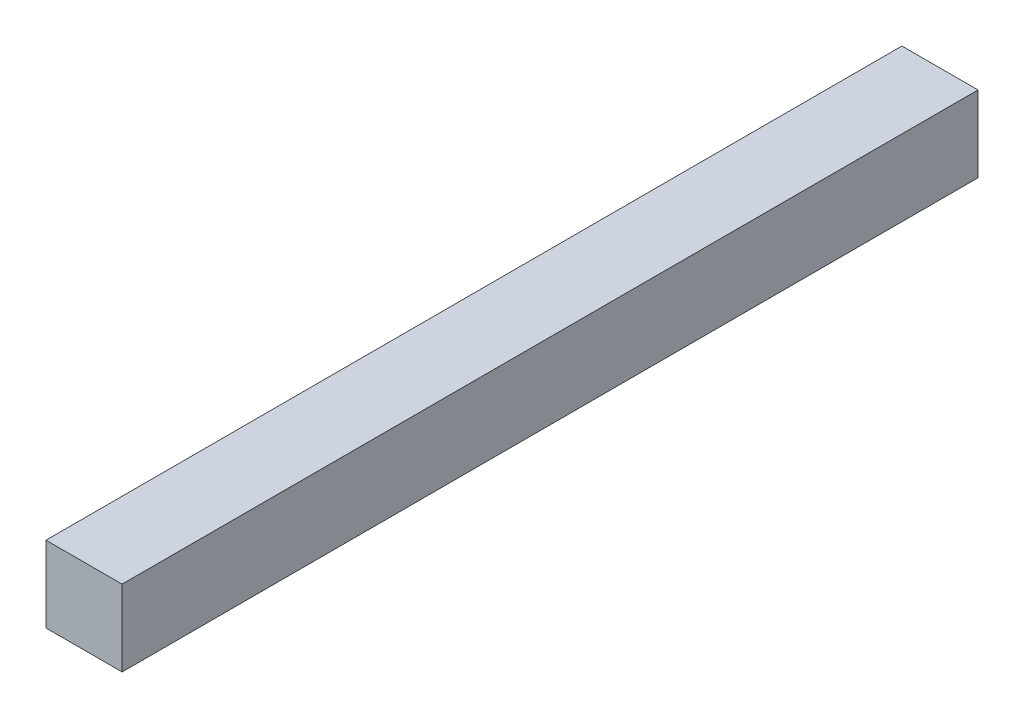
ISO-10303-21;
HEADER;
FILE_DESCRIPTION(('STEP AP214'),'2;1');
FILE_NAME('part.step','',(''),(''),'','','');
FILE_SCHEMA(('AUTOMOTIVE_DESIGN { 1 0 10303 214 1 1 1 1 }'));
ENDSEC;
DATA;
#1=APPLICATION_CONTEXT('core data for automotive mechanical design processes');
#2=APPLICATION_PROTOCOL_DEFINITION('international standard','automotive_design',2000,#1);
#3=PRODUCT_CONTEXT('',#1,'mechanical');
#4=PRODUCT('Part','Part','',(#3));
#5=PRODUCT_RELATED_PRODUCT_CATEGORY('part','',(#4));
#6=PRODUCT_DEFINITION_FORMATION('','',#4);
#7=PRODUCT_DEFINITION_CONTEXT('part definition',#1,'design');
#8=PRODUCT_DEFINITION('design','',#6,#7);
#9=PRODUCT_DEFINITION_SHAPE('','',#8);
#10=(LENGTH_UNIT() NAMED_UNIT(*) SI_UNIT(.MILLI.,.METRE.));
#11=(NAMED_UNIT(*) PLANE_ANGLE_UNIT() SI_UNIT($,.RADIAN.));
#12=(NAMED_UNIT(*) SI_UNIT($,.STERADIAN.) SOLID_ANGLE_UNIT());
#13=UNCERTAINTY_MEASURE_WITH_UNIT(LENGTH_MEASURE(1.E-05),#10,'distance_accuracy_value','');
#14=(GEOMETRIC_REPRESENTATION_CONTEXT(3) GLOBAL_UNCERTAINTY_ASSIGNED_CONTEXT((#13)) GLOBAL_UNIT_ASSIGNED_CONTEXT((#10,
#11,#12)) REPRESENTATION_CONTEXT('',''));
#15=CARTESIAN_POINT('',(0.,0.,0.));
#16=DIRECTION('',(0.,0.,1.));
#17=DIRECTION('',(1.,0.,0.));
#18=AXIS2_PLACEMENT_3D('',#15,#16,#17);
#19=CARTESIAN_POINT('',(0.,0.,1000.));
#20=DIRECTION('',(1.,0.,0.));
#21=DIRECTION('',(0.,0.,-1.));
#22=AXIS2_PLACEMENT_3D('',#19,#20,#21);
#23=PLANE('',#22);
#24=DIRECTION('',(0.,-1.,0.));
#25=VECTOR('',#24,1.);
#26=CARTESIAN_POINT('',(0.,0.,0.));
#27=LINE('',#26,#25);
#28=CARTESIAN_POINT('',(0.,88.9,0.));
#29=VERTEX_POINT('',#28);
#30=CARTESIAN_POINT('',(0.,0.,0.));
#31=VERTEX_POINT('',#30);
#32=EDGE_CURVE('E98',#29,#31,#27,.T.);
#33=ORIENTED_EDGE('',*,*,#32,.T.);
#34=DIRECTION('',(0.,0.,-1.));
#35=VECTOR('',#34,1.);
#36=CARTESIAN_POINT('',(0.,0.,1000.));
#37=LINE('',#36,#35);
#38=CARTESIAN_POINT('',(0.,0.,1000.));
#39=VERTEX_POINT('',#38);
#40=EDGE_CURVE('E11',#39,#31,#37,.T.);
#41=ORIENTED_EDGE('',*,*,#40,.F.);
#42=DIRECTION('',(0.,-1.,0.));
#43=VECTOR('',#42,1.);
#44=CARTESIAN_POINT('',(0.,0.,1000.));
#45=LINE('',#44,#43);
#46=CARTESIAN_POINT('',(0.,88.9,1000.));
#47=VERTEX_POINT('',#46);
#48=EDGE_CURVE('E86',#47,#39,#45,.T.);
#49=ORIENTED_EDGE('',*,*,#48,.F.);
#50=DIRECTION('',(0.,0.,-1.));
#51=VECTOR('',#50,1.);
#52=CARTESIAN_POINT('',(0.,88.9,1000.));
#53=LINE('',#52,#51);
#54=EDGE_CURVE('E94',#47,#29,#53,.T.);
#55=ORIENTED_EDGE('',*,*,#54,.T.);
#56=EDGE_LOOP('',(#33,#41,#49,#55));
#57=FACE_BOUND('',#56,.T.);
#58=ADVANCED_FACE('F35',(#57),#23,.F.);
#59=CARTESIAN_POINT('',(0.,0.,1000.));
#60=DIRECTION('',(0.,1.,0.));
#61=DIRECTION('',(0.,0.,1.));
#62=AXIS2_PLACEMENT_3D('',#59,#60,#61);
#63=PLANE('',#62);
#64=DIRECTION('',(1.,0.,0.));
#65=VECTOR('',#64,1.);
#66=CARTESIAN_POINT('',(0.,0.,0.));
#67=LINE('',#66,#65);
#68=CARTESIAN_POINT('',(88.9,0.,0.));
#69=VERTEX_POINT('',#68);
#70=EDGE_CURVE('E90',#31,#69,#67,.T.);
#71=ORIENTED_EDGE('',*,*,#70,.T.);
#72=DIRECTION('',(0.,0.,-1.));
#73=VECTOR('',#72,1.);
#74=CARTESIAN_POINT('',(88.9,0.,1000.));
#75=LINE('',#74,#73);
#76=CARTESIAN_POINT('',(88.9,0.,1000.));
#77=VERTEX_POINT('',#76);
#78=EDGE_CURVE('E43',#77,#69,#75,.T.);
#79=ORIENTED_EDGE('',*,*,#78,.F.);
#80=DIRECTION('',(1.,0.,0.));
#81=VECTOR('',#80,1.);
#82=CARTESIAN_POINT('',(0.,0.,1000.));
#83=LINE('',#82,#81);
#84=EDGE_CURVE('E81',#39,#77,#83,.T.);
#85=ORIENTED_EDGE('',*,*,#84,.F.);
#86=ORIENTED_EDGE('',*,*,#40,.T.);
#87=EDGE_LOOP('',(#71,#79,#85,#86));
#88=FACE_BOUND('',#87,.T.);
#89=ADVANCED_FACE('F89',(#88),#63,.F.);
#90=CARTESIAN_POINT('',(88.9,0.,1000.));
#91=DIRECTION('',(-1.,0.,0.));
#92=DIRECTION('',(0.,-1.,0.));
#93=AXIS2_PLACEMENT_3D('',#90,#91,#92);
#94=PLANE('',#93);
#95=DIRECTION('',(0.,1.,0.));
#96=VECTOR('',#95,1.);
#97=CARTESIAN_POINT('',(88.9,0.,0.));
#98=LINE('',#97,#96);
#99=CARTESIAN_POINT('',(88.9,88.9,0.));
#100=VERTEX_POINT('',#99);
#101=EDGE_CURVE('E68',#69,#100,#98,.T.);
#102=ORIENTED_EDGE('',*,*,#101,.T.);
#103=DIRECTION('',(0.,0.,-1.));
#104=VECTOR('',#103,1.);
#105=CARTESIAN_POINT('',(88.9,88.9,1000.));
#106=LINE('',#105,#104);
#107=CARTESIAN_POINT('',(88.9,88.9,1000.));
#108=VERTEX_POINT('',#107);
#109=EDGE_CURVE('E91',#108,#100,#106,.T.);
#110=ORIENTED_EDGE('',*,*,#109,.F.);
#111=DIRECTION('',(0.,1.,0.));
#112=VECTOR('',#111,1.);
#113=CARTESIAN_POINT('',(88.9,0.,1000.));
#114=LINE('',#113,#112);
#115=EDGE_CURVE('E84',#77,#108,#114,.T.);
#116=ORIENTED_EDGE('',*,*,#115,.F.);
#117=ORIENTED_EDGE('',*,*,#78,.T.);
#118=EDGE_LOOP('',(#102,#110,#116,#117));
#119=FACE_BOUND('',#118,.T.);
#120=ADVANCED_FACE('F92',(#119),#94,.F.);
#121=CARTESIAN_POINT('',(0.,88.9,1000.));
#122=DIRECTION('',(0.,-1.,0.));
#123=DIRECTION('',(1.,0.,0.));
#124=AXIS2_PLACEMENT_3D('',#121,#122,#123);
#125=PLANE('',#124);
#126=DIRECTION('',(-1.,0.,0.));
#127=VECTOR('',#126,1.);
#128=CARTESIAN_POINT('',(0.,88.9,0.));
#129=LINE('',#128,#127);
#130=EDGE_CURVE('E74',#100,#29,#129,.T.);
#131=ORIENTED_EDGE('',*,*,#130,.T.);
#132=ORIENTED_EDGE('',*,*,#54,.F.);
#133=DIRECTION('',(-1.,0.,0.));
#134=VECTOR('',#133,1.);
#135=CARTESIAN_POINT('',(0.,88.9,1000.));
#136=LINE('',#135,#134);
#137=EDGE_CURVE('E51',#108,#47,#136,.T.);
#138=ORIENTED_EDGE('',*,*,#137,.F.);
#139=ORIENTED_EDGE('',*,*,#109,.T.);
#140=EDGE_LOOP('',(#131,#132,#138,#139));
#141=FACE_BOUND('',#140,.T.);
#142=ADVANCED_FACE('F105',(#141),#125,.F.);
#143=CARTESIAN_POINT('',(0.,0.,1000.));
#144=DIRECTION('',(0.,0.,-1.));
#145=DIRECTION('',(-1.,0.,0.));
#146=AXIS2_PLACEMENT_3D('',#143,#144,#145);
#147=PLANE('',#146);
#148=ORIENTED_EDGE('',*,*,#48,.T.);
#149=ORIENTED_EDGE('',*,*,#84,.T.);
#150=ORIENTED_EDGE('',*,*,#115,.T.);
#151=ORIENTED_EDGE('',*,*,#137,.T.);
#152=EDGE_LOOP('',(#148,#149,#150,#151));
#153=FACE_BOUND('',#152,.T.);
#154=ADVANCED_FACE('F82',(#153),#147,.F.);
#155=CARTESIAN_POINT('',(0.,0.,0.));
#156=DIRECTION('',(0.,0.,-1.));
#157=DIRECTION('',(-1.,0.,0.));
#158=AXIS2_PLACEMENT_3D('',#155,#156,#157);
#159=PLANE('',#158);
#160=ORIENTED_EDGE('',*,*,#32,.F.);
#161=ORIENTED_EDGE('',*,*,#130,.F.);
#162=ORIENTED_EDGE('',*,*,#101,.F.);
#163=ORIENTED_EDGE('',*,*,#70,.F.);
#164=EDGE_LOOP('',(#160,#161,#162,#163));
#165=FACE_BOUND('',#164,.T.);
#166=ADVANCED_FACE('F108',(#165),#159,.T.);
#167=CLOSED_SHELL('',(#58,#89,#120,#142,#154,#166));
#168=MANIFOLD_SOLID_BREP('B2',#167);
#169=ADVANCED_BREP_SHAPE_REPRESENTATION('',(#18,#168),#14);
#170=SHAPE_DEFINITION_REPRESENTATION(#9,#169);
ENDSEC;
END-ISO-10303-21;
